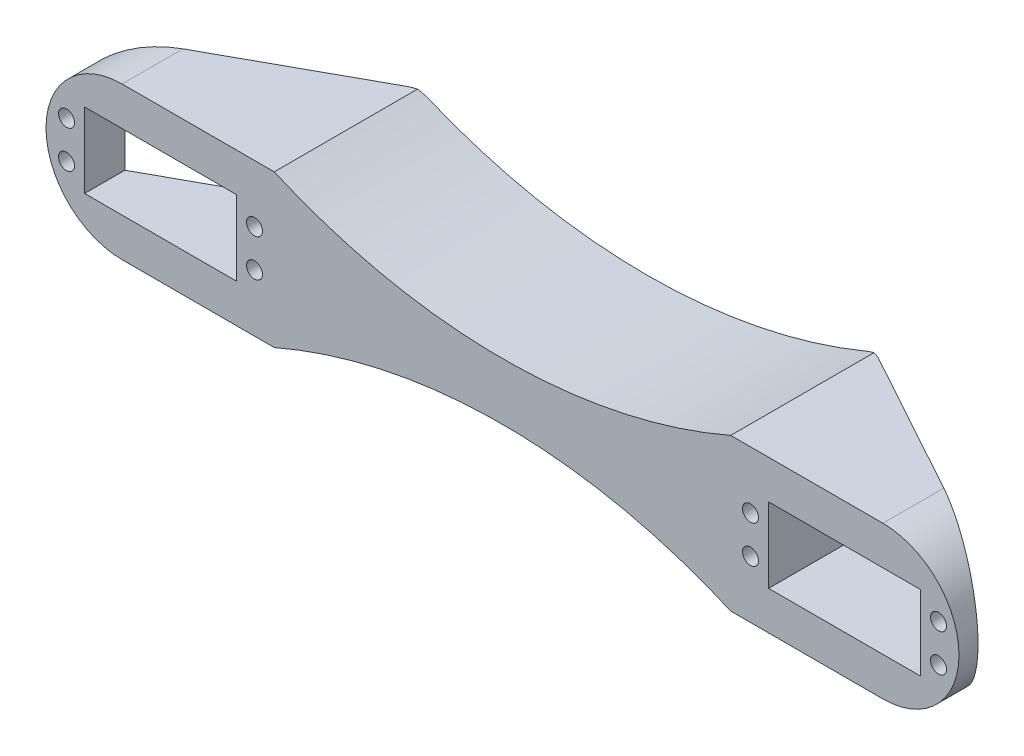
ISO-10303-21;
HEADER;
FILE_DESCRIPTION(('STEP AP214'),'2;1');
FILE_NAME('part.step','',(''),(''),'','','');
FILE_SCHEMA(('AUTOMOTIVE_DESIGN { 1 0 10303 214 1 1 1 1 }'));
ENDSEC;
DATA;
#1=APPLICATION_CONTEXT('core data for automotive mechanical design processes');
#2=APPLICATION_PROTOCOL_DEFINITION('international standard','automotive_design',2000,#1);
#3=PRODUCT_CONTEXT('',#1,'mechanical');
#4=PRODUCT('Part','Part','',(#3));
#5=PRODUCT_RELATED_PRODUCT_CATEGORY('part','',(#4));
#6=PRODUCT_DEFINITION_FORMATION('','',#4);
#7=PRODUCT_DEFINITION_CONTEXT('part definition',#1,'design');
#8=PRODUCT_DEFINITION('design','',#6,#7);
#9=PRODUCT_DEFINITION_SHAPE('','',#8);
#10=(LENGTH_UNIT() NAMED_UNIT(*) SI_UNIT(.MILLI.,.METRE.));
#11=(NAMED_UNIT(*) PLANE_ANGLE_UNIT() SI_UNIT($,.RADIAN.));
#12=(NAMED_UNIT(*) SI_UNIT($,.STERADIAN.) SOLID_ANGLE_UNIT());
#13=UNCERTAINTY_MEASURE_WITH_UNIT(LENGTH_MEASURE(1.E-05),#10,'distance_accuracy_value','');
#14=(GEOMETRIC_REPRESENTATION_CONTEXT(3) GLOBAL_UNCERTAINTY_ASSIGNED_CONTEXT((#13)) GLOBAL_UNIT_ASSIGNED_CONTEXT((#10,
#11,#12)) REPRESENTATION_CONTEXT('',''));
#15=CARTESIAN_POINT('',(0.,0.,0.));
#16=DIRECTION('',(0.,0.,1.));
#17=DIRECTION('',(1.,0.,0.));
#18=AXIS2_PLACEMENT_3D('',#15,#16,#17);
#19=CARTESIAN_POINT('',(-36.5051887767682,38.5934819897084,32.));
#20=DIRECTION('',(0.,1.,0.));
#21=DIRECTION('',(-1.,0.,0.));
#22=AXIS2_PLACEMENT_3D('',#19,#20,#21);
#23=CYLINDRICAL_SURFACE('',#22,10.);
#24=DIRECTION('',(0.,1.,0.));
#25=VECTOR('',#24,1.);
#26=CARTESIAN_POINT('',(-36.5051887767682,38.5934819897084,22.));
#27=LINE('',#26,#25);
#28=CARTESIAN_POINT('',(-36.5051887767682,-0.313840533737619,22.));
#29=VERTEX_POINT('',#28);
#30=CARTESIAN_POINT('',(-36.5051887767682,37.5008045131544,22.));
#31=VERTEX_POINT('',#30);
#32=EDGE_CURVE('E367',#29,#31,#27,.T.);
#33=ORIENTED_EDGE('',*,*,#32,.F.);
#34=CARTESIAN_POINT('',(-39.073756432247,-1.40651801029159,22.3355051762015));
#35=CARTESIAN_POINT('',(-38.7808975319075,-1.27869356042523,22.257657956709));
#36=CARTESIAN_POINT('',(-38.484639299242,-1.15052027733921,22.1931857973709));
#37=CARTESIAN_POINT('',(-37.8894697654478,-0.895328217320755,22.0917104592391));
#38=CARTESIAN_POINT('',(-37.5905913321791,-0.768307618714777,22.0545190184814));
#39=CARTESIAN_POINT('',(-36.9901832720468,-0.515463049608117,22.0072299774098));
#40=CARTESIAN_POINT('',(-36.6886535992128,-0.389639099935494,21.9971328478243));
#41=CARTESIAN_POINT('',(-36.0829416071585,-0.139197163652349,22.0042924866709));
#42=CARTESIAN_POINT('',(-35.778755520429,-0.0145938333329163,22.0217416824713));
#43=CARTESIAN_POINT('',(-35.4753760071928,0.108503406910627,22.0531670537995));
#44=B_SPLINE_CURVE_WITH_KNOTS('',3,(#34,#35,#36,#37,#38,#39,#40,#41,#42,#43),.UNSPECIFIED.,.F.,
.F.,(4,2,2,2,4),(0.,0.986363234291692,1.96585391922786,2.94536162142918,3.93174209814181),.UNSPECIFIED.);
#45=CARTESIAN_POINT('',(-39.073756432247,-1.40651801029159,22.3355051762015));
#46=VERTEX_POINT('',#45);
#47=EDGE_CURVE('E377',#46,#29,#44,.T.);
#48=ORIENTED_EDGE('',*,*,#47,.F.);
#49=CARTESIAN_POINT('',(-36.5051887767682,-1.40651801029159,32.));
#50=DIRECTION('',(0.,1.,0.));
#51=DIRECTION('',(-1.,0.,0.));
#52=AXIS2_PLACEMENT_3D('',#49,#50,#51);
#53=CIRCLE('',#52,10.);
#54=CARTESIAN_POINT('',(-41.3243762744897,-1.40651801029159,23.2378409132335));
#55=VERTEX_POINT('',#54);
#56=EDGE_CURVE('E374',#55,#46,#53,.F.);
#57=ORIENTED_EDGE('',*,*,#56,.F.);
#58=DIRECTION('',(0.,1.,0.));
#59=VECTOR('',#58,1.);
#60=CARTESIAN_POINT('',(-41.3243762744898,38.5934819897084,23.2378409132335));
#61=LINE('',#60,#59);
#62=CARTESIAN_POINT('',(-41.3243762744897,38.5934819897084,23.2378409132335));
#63=VERTEX_POINT('',#62);
#64=EDGE_CURVE('E371',#63,#55,#61,.F.);
#65=ORIENTED_EDGE('',*,*,#64,.F.);
#66=CARTESIAN_POINT('',(-36.5051887767682,38.5934819897084,32.));
#67=DIRECTION('',(0.,-1.,0.));
#68=DIRECTION('',(0.,0.,-1.));
#69=AXIS2_PLACEMENT_3D('',#66,#67,#68);
#70=CIRCLE('',#69,10.);
#71=CARTESIAN_POINT('',(-39.073756432247,38.5934819897084,22.3355051762015));
#72=VERTEX_POINT('',#71);
#73=EDGE_CURVE('E366',#72,#63,#70,.F.);
#74=ORIENTED_EDGE('',*,*,#73,.F.);
#75=CARTESIAN_POINT('',(-36.5051887767682,37.5008045131544,22.));
#76=CARTESIAN_POINT('',(-36.8107474438939,37.6274348146964,21.9999860536576));
#77=CARTESIAN_POINT('',(-37.1158635639228,37.7550878796777,22.0140044105638));
#78=CARTESIAN_POINT('',(-37.7209668442,38.0105809604784,22.0695683106162));
#79=CARTESIAN_POINT('',(-38.0209749588856,38.1384134070893,22.1109203985946));
#80=CARTESIAN_POINT('',(-38.6159563044999,38.3942068405388,22.2206249546986));
#81=CARTESIAN_POINT('',(-38.9109295432117,38.5221678271785,22.2889773810822));
#82=CARTESIAN_POINT('',(-39.495878262977,38.7781073277849,22.4528153843971));
#83=CARTESIAN_POINT('',(-39.7858038287382,38.9060796013979,22.5484889104595));
#84=CARTESIAN_POINT('',(-40.0711220785712,39.0330887302684,22.6574029474084));
#85=B_SPLINE_CURVE_WITH_KNOTS('',3,(#75,#76,#77,#78,#79,#80,#81,#82,#83,#84),.UNSPECIFIED.,.F.,
.F.,(4,2,2,2,4),(0.,0.991952407252828,1.97695835806068,2.96196278607222,3.95391366734705),.UNSPECIFIED.);
#86=EDGE_CURVE('E358',#31,#72,#85,.T.);
#87=ORIENTED_EDGE('',*,*,#86,.F.);
#88=EDGE_LOOP('',(#33,#48,#57,#65,#74,#87));
#89=FACE_BOUND('',#88,.T.);
#90=ADVANCED_FACE('F39',(#89),#23,.T.);
#91=CARTESIAN_POINT('',(78.3576759122742,38.5934819897084,32.));
#92=DIRECTION('',(0.,1.,0.));
#93=DIRECTION('',(-1.,0.,0.));
#94=AXIS2_PLACEMENT_3D('',#91,#92,#93);
#95=CYLINDRICAL_SURFACE('',#94,10.);
#96=DIRECTION('',(0.,1.,0.));
#97=VECTOR('',#96,1.);
#98=CARTESIAN_POINT('',(83.1768634099958,38.5934819897084,23.2378409132335));
#99=LINE('',#98,#97);
#100=CARTESIAN_POINT('',(83.1768634099958,-1.40651801029158,23.2378409132335));
#101=VERTEX_POINT('',#100);
#102=CARTESIAN_POINT('',(83.1768634099958,38.5934819897084,23.2378409132335));
#103=VERTEX_POINT('',#102);
#104=EDGE_CURVE('E324',#101,#103,#99,.T.);
#105=ORIENTED_EDGE('',*,*,#104,.F.);
#106=CARTESIAN_POINT('',(78.3576759122742,-1.40651801029158,32.));
#107=DIRECTION('',(0.,1.,0.));
#108=DIRECTION('',(-1.,0.,0.));
#109=AXIS2_PLACEMENT_3D('',#106,#107,#108);
#110=CIRCLE('',#109,10.);
#111=CARTESIAN_POINT('',(80.926243567753,-1.40651801029158,22.3355051762015));
#112=VERTEX_POINT('',#111);
#113=EDGE_CURVE('E428',#112,#101,#110,.F.);
#114=ORIENTED_EDGE('',*,*,#113,.F.);
#115=CARTESIAN_POINT('',(78.3576759122743,-0.313840533737675,22.));
#116=CARTESIAN_POINT('',(78.6632345794001,-0.44047083527966,21.9999860536576));
#117=CARTESIAN_POINT('',(78.9683506994289,-0.568123900260902,22.0140044105638));
#118=CARTESIAN_POINT('',(79.5734539797061,-0.823616981061645,22.0695683106162));
#119=CARTESIAN_POINT('',(79.8734620943917,-0.951449427672488,22.1109203985946));
#120=CARTESIAN_POINT('',(80.468443440006,-1.20724286112203,22.2206249546986));
#121=CARTESIAN_POINT('',(80.7634166787178,-1.3352038477617,22.2889773810822));
#122=CARTESIAN_POINT('',(81.3483653984832,-1.59114334836818,22.4528153843972));
#123=CARTESIAN_POINT('',(81.6382909642444,-1.71911562198116,22.5484889104595));
#124=CARTESIAN_POINT('',(81.9236092140774,-1.84612475085159,22.6574029474085));
#125=B_SPLINE_CURVE_WITH_KNOTS('',3,(#115,#116,#117,#118,#119,#120,#121,#122,#123,#124),
.UNSPECIFIED.,.F.,.F.,(4,2,2,2,4),(0.,0.99195240725282,1.97695835806067,2.96196278607222,
3.95391366734705),.UNSPECIFIED.);
#126=CARTESIAN_POINT('',(78.3576759122743,-0.313840533737675,22.));
#127=VERTEX_POINT('',#126);
#128=EDGE_CURVE('E434',#127,#112,#125,.T.);
#129=ORIENTED_EDGE('',*,*,#128,.F.);
#130=DIRECTION('',(0.,1.,0.));
#131=VECTOR('',#130,1.);
#132=CARTESIAN_POINT('',(78.3576759122742,38.5934819897084,22.));
#133=LINE('',#132,#131);
#134=CARTESIAN_POINT('',(78.3576759122742,37.5008045131545,22.));
#135=VERTEX_POINT('',#134);
#136=EDGE_CURVE('E340',#135,#127,#133,.F.);
#137=ORIENTED_EDGE('',*,*,#136,.F.);
#138=CARTESIAN_POINT('',(80.926243567753,38.5934819897084,22.3355051762015));
#139=CARTESIAN_POINT('',(80.6333846674135,38.465657539842,22.257657956709));
#140=CARTESIAN_POINT('',(80.3371264347481,38.337484256756,22.1931857973709));
#141=CARTESIAN_POINT('',(79.7419569009539,38.0822921967376,22.0917104592391));
#142=CARTESIAN_POINT('',(79.4430784676851,37.9552715981316,22.0545190184814));
#143=CARTESIAN_POINT('',(78.8426704075528,37.702427029025,22.0072299774098));
#144=CARTESIAN_POINT('',(78.5411407347188,37.5766030793523,21.9971328478243));
#145=CARTESIAN_POINT('',(77.9354287426646,37.3261611430691,22.0042924866709));
#146=CARTESIAN_POINT('',(77.6312426559351,37.2015578127497,22.0217416824713));
#147=CARTESIAN_POINT('',(77.3278631426988,37.0784605725062,22.0531670537995));
#148=B_SPLINE_CURVE_WITH_KNOTS('',3,(#138,#139,#140,#141,#142,#143,#144,#145,#146,#147),
.UNSPECIFIED.,.F.,.F.,(4,2,2,2,4),(0.,0.986363234291689,1.96585391922786,2.94536162142918,
3.93174209814182),.UNSPECIFIED.);
#149=CARTESIAN_POINT('',(80.926243567753,38.5934819897084,22.3355051762015));
#150=VERTEX_POINT('',#149);
#151=EDGE_CURVE('E332',#150,#135,#148,.T.);
#152=ORIENTED_EDGE('',*,*,#151,.F.);
#153=CARTESIAN_POINT('',(78.3576759122742,38.5934819897084,32.));
#154=DIRECTION('',(0.,-1.,0.));
#155=DIRECTION('',(0.,0.,-1.));
#156=AXIS2_PLACEMENT_3D('',#153,#154,#155);
#157=CIRCLE('',#156,10.);
#158=EDGE_CURVE('E329',#103,#150,#157,.F.);
#159=ORIENTED_EDGE('',*,*,#158,.F.);
#160=EDGE_LOOP('',(#105,#114,#129,#137,#152,#159));
#161=FACE_BOUND('',#160,.T.);
#162=ADVANCED_FACE('F342',(#161),#95,.T.);
#163=CARTESIAN_POINT('',(-79.073756432247,-1.40651801029159,60.));
#164=DIRECTION('',(0.,1.,0.));
#165=DIRECTION('',(-1.,0.,0.));
#166=AXIS2_PLACEMENT_3D('',#163,#164,#165);
#167=PLANE('',#166);
#168=DIRECTION('',(0.,0.,-1.));
#169=VECTOR('',#168,1.);
#170=CARTESIAN_POINT('',(80.926243567753,-1.40651801029158,60.));
#171=LINE('',#170,#169);
#172=CARTESIAN_POINT('',(80.926243567753,-1.40651801029158,60.));
#173=VERTEX_POINT('',#172);
#174=EDGE_CURVE('E221',#173,#112,#171,.T.);
#175=ORIENTED_EDGE('',*,*,#174,.T.);
#176=ORIENTED_EDGE('',*,*,#113,.T.);
#177=DIRECTION('',(-0.876215908676647,0.,-0.481918749772156));
#178=VECTOR('',#177,1.);
#179=CARTESIAN_POINT('',(40.926243567753,-1.40651801029159,0.));
#180=LINE('',#179,#178);
#181=CARTESIAN_POINT('',(120.926243567753,-1.40651801029158,44.));
#182=VERTEX_POINT('',#181);
#183=EDGE_CURVE('E235',#182,#101,#180,.T.);
#184=ORIENTED_EDGE('',*,*,#183,.F.);
#185=DIRECTION('',(0.,0.,-1.));
#186=VECTOR('',#185,1.);
#187=CARTESIAN_POINT('',(120.926243567753,-1.40651801029159,60.));
#188=LINE('',#187,#186);
#189=CARTESIAN_POINT('',(120.926243567753,-1.40651801029159,60.));
#190=VERTEX_POINT('',#189);
#191=EDGE_CURVE('E318',#190,#182,#188,.T.);
#192=ORIENTED_EDGE('',*,*,#191,.F.);
#193=DIRECTION('',(1.,0.,0.));
#194=VECTOR('',#193,1.);
#195=CARTESIAN_POINT('',(-79.073756432247,-1.40651801029159,60.));
#196=LINE('',#195,#194);
#197=EDGE_CURVE('E302',#173,#190,#196,.T.);
#198=ORIENTED_EDGE('',*,*,#197,.F.);
#199=EDGE_LOOP('',(#175,#176,#184,#192,#198));
#200=FACE_BOUND('',#199,.T.);
#201=ADVANCED_FACE('F421',(#200),#167,.F.);
#202=CARTESIAN_POINT('',(-79.073756432247,38.5934819897084,60.));
#203=DIRECTION('',(0.,-1.,0.));
#204=DIRECTION('',(0.,0.,-1.));
#205=AXIS2_PLACEMENT_3D('',#202,#203,#204);
#206=PLANE('',#205);
#207=DIRECTION('',(0.,0.,-1.));
#208=VECTOR('',#207,1.);
#209=CARTESIAN_POINT('',(-39.073756432247,38.5934819897084,60.));
#210=LINE('',#209,#208);
#211=CARTESIAN_POINT('',(-39.073756432247,38.5934819897084,60.));
#212=VERTEX_POINT('',#211);
#213=EDGE_CURVE('E210',#212,#72,#210,.T.);
#214=ORIENTED_EDGE('',*,*,#213,.T.);
#215=ORIENTED_EDGE('',*,*,#73,.T.);
#216=DIRECTION('',(-0.876215908676647,0.,0.481918749772156));
#217=VECTOR('',#216,1.);
#218=CARTESIAN_POINT('',(0.926243567753003,38.5934819897084,0.));
#219=LINE('',#218,#217);
#220=CARTESIAN_POINT('',(-79.073756432247,38.5934819897084,44.));
#221=VERTEX_POINT('',#220);
#222=EDGE_CURVE('E218',#63,#221,#219,.T.);
#223=ORIENTED_EDGE('',*,*,#222,.T.);
#224=DIRECTION('',(0.,0.,-1.));
#225=VECTOR('',#224,1.);
#226=CARTESIAN_POINT('',(-79.073756432247,38.5934819897084,60.));
#227=LINE('',#226,#225);
#228=CARTESIAN_POINT('',(-79.073756432247,38.5934819897084,60.));
#229=VERTEX_POINT('',#228);
#230=EDGE_CURVE('E312',#229,#221,#227,.T.);
#231=ORIENTED_EDGE('',*,*,#230,.F.);
#232=DIRECTION('',(-1.,0.,0.));
#233=VECTOR('',#232,1.);
#234=CARTESIAN_POINT('',(-79.073756432247,38.5934819897084,60.));
#235=LINE('',#234,#233);
#236=EDGE_CURVE('E308',#212,#229,#235,.T.);
#237=ORIENTED_EDGE('',*,*,#236,.F.);
#238=EDGE_LOOP('',(#214,#215,#223,#231,#237));
#239=FACE_BOUND('',#238,.T.);
#240=ADVANCED_FACE('F462',(#239),#206,.F.);
#241=CARTESIAN_POINT('',(-79.073756432247,18.5934819897084,60.));
#242=DIRECTION('',(0.,0.,1.));
#243=DIRECTION('',(1.,0.,0.));
#244=AXIS2_PLACEMENT_3D('',#241,#242,#243);
#245=PLANE('',#244);
#246=CARTESIAN_POINT('',(-44.2626108142468,13.6684819897085,60.));
#247=DIRECTION('',(0.,0.,1.));
#248=DIRECTION('',(1.,0.,0.));
#249=AXIS2_PLACEMENT_3D('',#246,#247,#248);
#250=CIRCLE('',#249,2.10000000000001);
#251=CARTESIAN_POINT('',(-42.1626108142468,13.6684819897085,60.));
#252=VERTEX_POINT('',#251);
#253=EDGE_CURVE('E724',#252,#252,#250,.T.);
#254=ORIENTED_EDGE('',*,*,#253,.F.);
#255=EDGE_LOOP('',(#254));
#256=FACE_BOUND('',#255,.T.);
#257=CARTESIAN_POINT('',(-44.2626108142468,23.5184819897085,60.));
#258=DIRECTION('',(0.,0.,1.));
#259=DIRECTION('',(1.,0.,0.));
#260=AXIS2_PLACEMENT_3D('',#257,#258,#259);
#261=CIRCLE('',#260,2.10000000000001);
#262=CARTESIAN_POINT('',(-42.1626108142468,23.5184819897085,60.));
#263=VERTEX_POINT('',#262);
#264=EDGE_CURVE('E726',#263,#263,#261,.T.);
#265=ORIENTED_EDGE('',*,*,#264,.F.);
#266=EDGE_LOOP('',(#265));
#267=FACE_BOUND('',#266,.T.);
#268=CARTESIAN_POINT('',(-93.6849020502472,13.6684819897084,60.));
#269=DIRECTION('',(0.,0.,1.));
#270=DIRECTION('',(1.,0.,0.));
#271=AXIS2_PLACEMENT_3D('',#268,#269,#270);
#272=CIRCLE('',#271,2.10000000000002);
#273=CARTESIAN_POINT('',(-91.5849020502471,13.6684819897084,60.));
#274=VERTEX_POINT('',#273);
#275=EDGE_CURVE('E713',#274,#274,#272,.T.);
#276=ORIENTED_EDGE('',*,*,#275,.F.);
#277=EDGE_LOOP('',(#276));
#278=FACE_BOUND('',#277,.T.);
#279=CARTESIAN_POINT('',(-93.6849020502472,23.5184819897084,60.));
#280=DIRECTION('',(0.,0.,1.));
#281=DIRECTION('',(1.,0.,0.));
#282=AXIS2_PLACEMENT_3D('',#279,#280,#281);
#283=CIRCLE('',#282,2.1);
#284=CARTESIAN_POINT('',(-91.5849020502472,23.5184819897084,60.));
#285=VERTEX_POINT('',#284);
#286=EDGE_CURVE('E720',#285,#285,#283,.T.);
#287=ORIENTED_EDGE('',*,*,#286,.F.);
#288=EDGE_LOOP('',(#287));
#289=FACE_BOUND('',#288,.T.);
#290=DIRECTION('',(0.,-1.,0.));
#291=VECTOR('',#290,1.);
#292=CARTESIAN_POINT('',(-88.923756432247,8.74348198970844,60.));
#293=LINE('',#292,#291);
#294=CARTESIAN_POINT('',(-88.923756432247,28.4434819897085,60.));
#295=VERTEX_POINT('',#294);
#296=CARTESIAN_POINT('',(-88.923756432247,8.74348198970844,60.));
#297=VERTEX_POINT('',#296);
#298=EDGE_CURVE('E56',#295,#297,#293,.T.);
#299=ORIENTED_EDGE('',*,*,#298,.F.);
#300=DIRECTION('',(-1.,0.,0.));
#301=VECTOR('',#300,1.);
#302=CARTESIAN_POINT('',(-88.923756432247,28.4434819897085,60.));
#303=LINE('',#302,#301);
#304=CARTESIAN_POINT('',(-49.023756432247,28.4434819897085,60.));
#305=VERTEX_POINT('',#304);
#306=EDGE_CURVE('E197',#305,#295,#303,.T.);
#307=ORIENTED_EDGE('',*,*,#306,.F.);
#308=DIRECTION('',(0.,1.,0.));
#309=VECTOR('',#308,1.);
#310=CARTESIAN_POINT('',(-49.023756432247,28.4434819897085,60.));
#311=LINE('',#310,#309);
#312=CARTESIAN_POINT('',(-49.023756432247,8.74348198970845,60.));
#313=VERTEX_POINT('',#312);
#314=EDGE_CURVE('E181',#313,#305,#311,.T.);
#315=ORIENTED_EDGE('',*,*,#314,.F.);
#316=DIRECTION('',(1.,0.,0.));
#317=VECTOR('',#316,1.);
#318=CARTESIAN_POINT('',(-49.023756432247,8.74348198970845,60.));
#319=LINE('',#318,#317);
#320=EDGE_CURVE('E190',#297,#313,#319,.T.);
#321=ORIENTED_EDGE('',*,*,#320,.F.);
#322=EDGE_LOOP('',(#299,#307,#315,#321));
#323=FACE_BOUND('',#322,.T.);
#324=CARTESIAN_POINT('',(20.926243567753,176.070752838384,60.));
#325=DIRECTION('',(0.,0.,-1.));
#326=DIRECTION('',(-1.,0.,0.));
#327=AXIS2_PLACEMENT_3D('',#324,#325,#326);
#328=CIRCLE('',#327,150.);
#329=CARTESIAN_POINT('',(80.926243567753,38.5934819897084,60.));
#330=VERTEX_POINT('',#329);
#331=EDGE_CURVE('E207',#330,#212,#328,.T.);
#332=ORIENTED_EDGE('',*,*,#331,.T.);
#333=ORIENTED_EDGE('',*,*,#236,.T.);
#334=CARTESIAN_POINT('',(-79.073756432247,18.5934819897084,60.));
#335=DIRECTION('',(0.,0.,1.));
#336=DIRECTION('',(1.,0.,0.));
#337=AXIS2_PLACEMENT_3D('',#334,#335,#336);
#338=CIRCLE('',#337,20.);
#339=CARTESIAN_POINT('',(-79.073756432247,-1.40651801029159,60.));
#340=VERTEX_POINT('',#339);
#341=EDGE_CURVE('E294',#229,#340,#338,.T.);
#342=ORIENTED_EDGE('',*,*,#341,.T.);
#343=CARTESIAN_POINT('',(-39.073756432247,-1.40651801029159,60.));
#344=VERTEX_POINT('',#343);
#345=EDGE_CURVE('E303',#340,#344,#196,.T.);
#346=ORIENTED_EDGE('',*,*,#345,.T.);
#347=CARTESIAN_POINT('',(20.926243567753,-138.883788858967,60.));
#348=DIRECTION('',(0.,0.,-1.));
#349=DIRECTION('',(1.,0.,0.));
#350=AXIS2_PLACEMENT_3D('',#347,#348,#349);
#351=CIRCLE('',#350,150.);
#352=EDGE_CURVE('E224',#344,#173,#351,.T.);
#353=ORIENTED_EDGE('',*,*,#352,.T.);
#354=ORIENTED_EDGE('',*,*,#197,.T.);
#355=CARTESIAN_POINT('',(120.926243567753,18.5934819897084,60.));
#356=DIRECTION('',(0.,0.,1.));
#357=DIRECTION('',(1.,0.,0.));
#358=AXIS2_PLACEMENT_3D('',#355,#356,#357);
#359=CIRCLE('',#358,20.);
#360=CARTESIAN_POINT('',(120.926243567753,38.5934819897084,60.));
#361=VERTEX_POINT('',#360);
#362=EDGE_CURVE('E306',#190,#361,#359,.T.);
#363=ORIENTED_EDGE('',*,*,#362,.T.);
#364=EDGE_CURVE('E309',#361,#330,#235,.T.);
#365=ORIENTED_EDGE('',*,*,#364,.T.);
#366=EDGE_LOOP('',(#332,#333,#342,#346,#353,#354,#363,#365));
#367=FACE_BOUND('',#366,.T.);
#368=CARTESIAN_POINT('',(135.537389185753,13.6684819897084,60.));
#369=DIRECTION('',(0.,0.,1.));
#370=DIRECTION('',(1.,0.,0.));
#371=AXIS2_PLACEMENT_3D('',#368,#369,#370);
#372=CIRCLE('',#371,2.10000000000002);
#373=CARTESIAN_POINT('',(137.637389185753,13.6684819897084,60.));
#374=VERTEX_POINT('',#373);
#375=EDGE_CURVE('E267',#374,#374,#372,.T.);
#376=ORIENTED_EDGE('',*,*,#375,.F.);
#377=EDGE_LOOP('',(#376));
#378=FACE_BOUND('',#377,.T.);
#379=CARTESIAN_POINT('',(135.537389185753,23.5184819897084,60.));
#380=DIRECTION('',(0.,0.,1.));
#381=DIRECTION('',(1.,0.,0.));
#382=AXIS2_PLACEMENT_3D('',#379,#380,#381);
#383=CIRCLE('',#382,2.10000000000002);
#384=CARTESIAN_POINT('',(137.637389185753,23.5184819897084,60.));
#385=VERTEX_POINT('',#384);
#386=EDGE_CURVE('E275',#385,#385,#383,.T.);
#387=ORIENTED_EDGE('',*,*,#386,.F.);
#388=EDGE_LOOP('',(#387));
#389=FACE_BOUND('',#388,.T.);
#390=CARTESIAN_POINT('',(86.1150979497529,13.6684819897084,60.));
#391=DIRECTION('',(0.,0.,1.));
#392=DIRECTION('',(1.,0.,0.));
#393=AXIS2_PLACEMENT_3D('',#390,#391,#392);
#394=CIRCLE('',#393,2.1);
#395=CARTESIAN_POINT('',(88.2150979497529,13.6684819897084,60.));
#396=VERTEX_POINT('',#395);
#397=EDGE_CURVE('E272',#396,#396,#394,.T.);
#398=ORIENTED_EDGE('',*,*,#397,.F.);
#399=EDGE_LOOP('',(#398));
#400=FACE_BOUND('',#399,.T.);
#401=CARTESIAN_POINT('',(86.1150979497529,23.5184819897084,60.));
#402=DIRECTION('',(0.,0.,1.));
#403=DIRECTION('',(1.,0.,0.));
#404=AXIS2_PLACEMENT_3D('',#401,#402,#403);
#405=CIRCLE('',#404,2.1);
#406=CARTESIAN_POINT('',(88.2150979497529,23.5184819897084,60.));
#407=VERTEX_POINT('',#406);
#408=EDGE_CURVE('E268',#407,#407,#405,.T.);
#409=ORIENTED_EDGE('',*,*,#408,.F.);
#410=EDGE_LOOP('',(#409));
#411=FACE_BOUND('',#410,.T.);
#412=DIRECTION('',(0.,-1.,0.));
#413=VECTOR('',#412,1.);
#414=CARTESIAN_POINT('',(90.8762435677534,8.74348198970842,60.));
#415=LINE('',#414,#413);
#416=CARTESIAN_POINT('',(90.8762435677534,28.4434819897084,60.));
#417=VERTEX_POINT('',#416);
#418=CARTESIAN_POINT('',(90.8762435677534,8.74348198970842,60.));
#419=VERTEX_POINT('',#418);
#420=EDGE_CURVE('E271',#417,#419,#415,.T.);
#421=ORIENTED_EDGE('',*,*,#420,.F.);
#422=DIRECTION('',(-1.,0.,0.));
#423=VECTOR('',#422,1.);
#424=CARTESIAN_POINT('',(90.8762435677534,28.4434819897084,60.));
#425=LINE('',#424,#423);
#426=CARTESIAN_POINT('',(130.776243567753,28.4434819897084,60.));
#427=VERTEX_POINT('',#426);
#428=EDGE_CURVE('E288',#427,#417,#425,.T.);
#429=ORIENTED_EDGE('',*,*,#428,.F.);
#430=DIRECTION('',(0.,1.,0.));
#431=VECTOR('',#430,1.);
#432=CARTESIAN_POINT('',(130.776243567753,28.4434819897084,60.));
#433=LINE('',#432,#431);
#434=CARTESIAN_POINT('',(130.776243567753,8.74348198970842,60.));
#435=VERTEX_POINT('',#434);
#436=EDGE_CURVE('E285',#435,#427,#433,.T.);
#437=ORIENTED_EDGE('',*,*,#436,.F.);
#438=DIRECTION('',(1.,0.,0.));
#439=VECTOR('',#438,1.);
#440=CARTESIAN_POINT('',(130.776243567753,8.74348198970842,60.));
#441=LINE('',#440,#439);
#442=EDGE_CURVE('E282',#419,#435,#441,.T.);
#443=ORIENTED_EDGE('',*,*,#442,.F.);
#444=EDGE_LOOP('',(#421,#429,#437,#443));
#445=FACE_BOUND('',#444,.T.);
#446=ADVANCED_FACE('F194',(#256,#267,#278,#289,#323,#367,#378,#389,#400,#411,#445),#245,.T.);
#447=CARTESIAN_POINT('',(-79.073756432247,18.5934819897084,60.));
#448=DIRECTION('',(0.,0.,-1.));
#449=DIRECTION('',(-1.,0.,0.));
#450=AXIS2_PLACEMENT_3D('',#447,#448,#449);
#451=CYLINDRICAL_SURFACE('',#450,20.);
#452=ORIENTED_EDGE('',*,*,#230,.T.);
#453=CARTESIAN_POINT('',(-79.073756432247,18.5934819897084,44.));
#454=DIRECTION('',(0.481918749772156,0.,0.876215908676647));
#455=DIRECTION('',(0.876215908676647,0.,-0.481918749772156));
#456=AXIS2_PLACEMENT_3D('',#453,#454,#455);
#457=ELLIPSE('',#456,22.8254244210267,20.);
#458=CARTESIAN_POINT('',(-79.073756432247,-1.40651801029159,44.));
#459=VERTEX_POINT('',#458);
#460=EDGE_CURVE('E264',#221,#459,#457,.T.);
#461=ORIENTED_EDGE('',*,*,#460,.T.);
#462=DIRECTION('',(0.,0.,-1.));
#463=VECTOR('',#462,1.);
#464=CARTESIAN_POINT('',(-79.073756432247,-1.40651801029159,60.));
#465=LINE('',#464,#463);
#466=EDGE_CURVE('E321',#340,#459,#465,.T.);
#467=ORIENTED_EDGE('',*,*,#466,.F.);
#468=ORIENTED_EDGE('',*,*,#341,.F.);
#469=EDGE_LOOP('',(#452,#461,#467,#468));
#470=FACE_BOUND('',#469,.T.);
#471=ADVANCED_FACE('F470',(#470),#451,.T.);
#472=DIRECTION('',(-0.876215908676647,0.,0.481918749772156));
#473=VECTOR('',#472,1.);
#474=CARTESIAN_POINT('',(0.926243567753005,-1.40651801029159,0.));
#475=LINE('',#474,#473);
#476=EDGE_CURVE('E238',#55,#459,#475,.T.);
#477=ORIENTED_EDGE('',*,*,#476,.F.);
#478=ORIENTED_EDGE('',*,*,#56,.T.);
#479=DIRECTION('',(0.,0.,-1.));
#480=VECTOR('',#479,1.);
#481=CARTESIAN_POINT('',(-39.073756432247,-1.40651801029159,60.));
#482=LINE('',#481,#480);
#483=EDGE_CURVE('E225',#344,#46,#482,.T.);
#484=ORIENTED_EDGE('',*,*,#483,.F.);
#485=ORIENTED_EDGE('',*,*,#345,.F.);
#486=ORIENTED_EDGE('',*,*,#466,.T.);
#487=EDGE_LOOP('',(#477,#478,#484,#485,#486));
#488=FACE_BOUND('',#487,.T.);
#489=ADVANCED_FACE('F456',(#488),#167,.F.);
#490=CARTESIAN_POINT('',(120.926243567753,18.5934819897084,60.));
#491=DIRECTION('',(0.,0.,-1.));
#492=DIRECTION('',(-1.,0.,0.));
#493=AXIS2_PLACEMENT_3D('',#490,#491,#492);
#494=CYLINDRICAL_SURFACE('',#493,20.);
#495=ORIENTED_EDGE('',*,*,#191,.T.);
#496=CARTESIAN_POINT('',(120.926243567753,18.5934819897084,44.));
#497=DIRECTION('',(-0.481918749772156,0.,0.876215908676647));
#498=DIRECTION('',(-0.876215908676647,0.,-0.481918749772156));
#499=AXIS2_PLACEMENT_3D('',#496,#497,#498);
#500=ELLIPSE('',#499,22.8254244210267,20.);
#501=CARTESIAN_POINT('',(120.926243567753,38.5934819897084,44.));
#502=VERTEX_POINT('',#501);
#503=EDGE_CURVE('E262',#182,#502,#500,.T.);
#504=ORIENTED_EDGE('',*,*,#503,.T.);
#505=DIRECTION('',(0.,0.,-1.));
#506=VECTOR('',#505,1.);
#507=CARTESIAN_POINT('',(120.926243567753,38.5934819897084,60.));
#508=LINE('',#507,#506);
#509=EDGE_CURVE('E315',#361,#502,#508,.T.);
#510=ORIENTED_EDGE('',*,*,#509,.F.);
#511=ORIENTED_EDGE('',*,*,#362,.F.);
#512=EDGE_LOOP('',(#495,#504,#510,#511));
#513=FACE_BOUND('',#512,.T.);
#514=ADVANCED_FACE('F449',(#513),#494,.T.);
#515=DIRECTION('',(-0.876215908676647,0.,-0.481918749772156));
#516=VECTOR('',#515,1.);
#517=CARTESIAN_POINT('',(40.926243567753,38.5934819897084,0.));
#518=LINE('',#517,#516);
#519=EDGE_CURVE('E231',#502,#103,#518,.T.);
#520=ORIENTED_EDGE('',*,*,#519,.T.);
#521=ORIENTED_EDGE('',*,*,#158,.T.);
#522=DIRECTION('',(0.,0.,-1.));
#523=VECTOR('',#522,1.);
#524=CARTESIAN_POINT('',(80.926243567753,38.5934819897084,60.));
#525=LINE('',#524,#523);
#526=EDGE_CURVE('E215',#330,#150,#525,.T.);
#527=ORIENTED_EDGE('',*,*,#526,.F.);
#528=ORIENTED_EDGE('',*,*,#364,.F.);
#529=ORIENTED_EDGE('',*,*,#509,.T.);
#530=EDGE_LOOP('',(#520,#521,#527,#528,#529));
#531=FACE_BOUND('',#530,.T.);
#532=ADVANCED_FACE('F467',(#531),#206,.F.);
#533=CARTESIAN_POINT('',(90.8762435677534,8.74348198970842,0.));
#534=DIRECTION('',(-1.,0.,0.));
#535=DIRECTION('',(0.,0.,1.));
#536=AXIS2_PLACEMENT_3D('',#533,#534,#535);
#537=PLANE('',#536);
#538=DIRECTION('',(0.,0.,1.));
#539=VECTOR('',#538,1.);
#540=CARTESIAN_POINT('',(90.8762435677534,8.74348198970842,0.));
#541=LINE('',#540,#539);
#542=CARTESIAN_POINT('',(90.8762435677534,8.74348198970842,27.4725000000002));
#543=VERTEX_POINT('',#542);
#544=EDGE_CURVE('E291',#543,#419,#541,.T.);
#545=ORIENTED_EDGE('',*,*,#544,.F.);
#546=DIRECTION('',(0.,1.,0.));
#547=VECTOR('',#546,1.);
#548=CARTESIAN_POINT('',(90.8762435677534,8.74348198970842,27.4725000000002));
#549=LINE('',#548,#547);
#550=CARTESIAN_POINT('',(90.8762435677534,28.4434819897084,27.4725000000002));
#551=VERTEX_POINT('',#550);
#552=EDGE_CURVE('E259',#543,#551,#549,.T.);
#553=ORIENTED_EDGE('',*,*,#552,.T.);
#554=DIRECTION('',(0.,0.,1.));
#555=VECTOR('',#554,1.);
#556=CARTESIAN_POINT('',(90.8762435677534,28.4434819897084,0.));
#557=LINE('',#556,#555);
#558=EDGE_CURVE('E292',#551,#417,#557,.T.);
#559=ORIENTED_EDGE('',*,*,#558,.T.);
#560=ORIENTED_EDGE('',*,*,#420,.T.);
#561=EDGE_LOOP('',(#545,#553,#559,#560));
#562=FACE_BOUND('',#561,.T.);
#563=ADVANCED_FACE('F483',(#562),#537,.F.);
#564=CARTESIAN_POINT('',(90.8762435677534,28.4434819897084,0.));
#565=DIRECTION('',(0.,1.,0.));
#566=DIRECTION('',(-1.,0.,0.));
#567=AXIS2_PLACEMENT_3D('',#564,#565,#566);
#568=PLANE('',#567);
#569=ORIENTED_EDGE('',*,*,#558,.F.);
#570=DIRECTION('',(0.876215908676647,0.,0.481918749772156));
#571=VECTOR('',#570,1.);
#572=CARTESIAN_POINT('',(79.2755717827245,28.4434819897084,21.0921305182343));
#573=LINE('',#572,#571);
#574=CARTESIAN_POINT('',(130.776243567753,28.4434819897084,49.4175000000002));
#575=VERTEX_POINT('',#574);
#576=EDGE_CURVE('E256',#551,#575,#573,.T.);
#577=ORIENTED_EDGE('',*,*,#576,.T.);
#578=DIRECTION('',(0.,0.,1.));
#579=VECTOR('',#578,1.);
#580=CARTESIAN_POINT('',(130.776243567753,28.4434819897084,0.));
#581=LINE('',#580,#579);
#582=EDGE_CURVE('E295',#575,#427,#581,.T.);
#583=ORIENTED_EDGE('',*,*,#582,.T.);
#584=ORIENTED_EDGE('',*,*,#428,.T.);
#585=EDGE_LOOP('',(#569,#577,#583,#584));
#586=FACE_BOUND('',#585,.T.);
#587=ADVANCED_FACE('F487',(#586),#568,.F.);
#588=CARTESIAN_POINT('',(130.776243567753,28.4434819897084,0.));
#589=DIRECTION('',(1.,0.,0.));
#590=DIRECTION('',(0.,0.,-1.));
#591=AXIS2_PLACEMENT_3D('',#588,#589,#590);
#592=PLANE('',#591);
#593=ORIENTED_EDGE('',*,*,#582,.F.);
#594=DIRECTION('',(0.,-1.,0.));
#595=VECTOR('',#594,1.);
#596=CARTESIAN_POINT('',(130.776243567753,28.4434819897084,49.4175000000002));
#597=LINE('',#596,#595);
#598=CARTESIAN_POINT('',(130.776243567753,8.74348198970842,49.4175000000002));
#599=VERTEX_POINT('',#598);
#600=EDGE_CURVE('E253',#575,#599,#597,.T.);
#601=ORIENTED_EDGE('',*,*,#600,.T.);
#602=DIRECTION('',(0.,0.,1.));
#603=VECTOR('',#602,1.);
#604=CARTESIAN_POINT('',(130.776243567753,8.74348198970842,0.));
#605=LINE('',#604,#603);
#606=EDGE_CURVE('E297',#599,#435,#605,.T.);
#607=ORIENTED_EDGE('',*,*,#606,.T.);
#608=ORIENTED_EDGE('',*,*,#436,.T.);
#609=EDGE_LOOP('',(#593,#601,#607,#608));
#610=FACE_BOUND('',#609,.T.);
#611=ADVANCED_FACE('F493',(#610),#592,.F.);
#612=CARTESIAN_POINT('',(130.776243567753,8.74348198970842,0.));
#613=DIRECTION('',(0.,-1.,0.));
#614=DIRECTION('',(1.,0.,0.));
#615=AXIS2_PLACEMENT_3D('',#612,#613,#614);
#616=PLANE('',#615);
#617=ORIENTED_EDGE('',*,*,#606,.F.);
#618=DIRECTION('',(-0.876215908676647,0.,-0.481918749772156));
#619=VECTOR('',#618,1.);
#620=CARTESIAN_POINT('',(109.908969095584,8.74348198970842,37.9404990403073));
#621=LINE('',#620,#619);
#622=EDGE_CURVE('E250',#599,#543,#621,.T.);
#623=ORIENTED_EDGE('',*,*,#622,.T.);
#624=ORIENTED_EDGE('',*,*,#544,.T.);
#625=ORIENTED_EDGE('',*,*,#442,.T.);
#626=EDGE_LOOP('',(#617,#623,#624,#625));
#627=FACE_BOUND('',#626,.T.);
#628=ADVANCED_FACE('F489',(#627),#616,.F.);
#629=CARTESIAN_POINT('',(86.1150979497529,23.5184819897084,0.));
#630=DIRECTION('',(0.,0.,1.));
#631=DIRECTION('',(1.,0.,0.));
#632=AXIS2_PLACEMENT_3D('',#629,#630,#631);
#633=CYLINDRICAL_SURFACE('',#632,2.1);
#634=CARTESIAN_POINT('',(86.1150979497529,23.5184819897084,24.8538699100999));
#635=DIRECTION('',(-0.481918749772156,0.,0.876215908676647));
#636=DIRECTION('',(0.876215908676647,0.,0.481918749772156));
#637=AXIS2_PLACEMENT_3D('',#634,#635,#636);
#638=ELLIPSE('',#637,2.3966695642078,2.1);
#639=CARTESIAN_POINT('',(88.2150979497529,23.5184819897084,26.0088699100999));
#640=VERTEX_POINT('',#639);
#641=EDGE_CURVE('E247',#640,#640,#638,.F.);
#642=ORIENTED_EDGE('',*,*,#641,.T.);
#643=EDGE_LOOP('',(#642));
#644=FACE_BOUND('',#643,.T.);
#645=ORIENTED_EDGE('',*,*,#408,.T.);
#646=EDGE_LOOP('',(#645));
#647=FACE_BOUND('',#646,.T.);
#648=ADVANCED_FACE('F492',(#644,#647),#633,.F.);
#649=CARTESIAN_POINT('',(86.1150979497529,13.6684819897084,0.));
#650=DIRECTION('',(0.,0.,1.));
#651=DIRECTION('',(1.,0.,0.));
#652=AXIS2_PLACEMENT_3D('',#649,#650,#651);
#653=CYLINDRICAL_SURFACE('',#652,2.1);
#654=CARTESIAN_POINT('',(86.1150979497529,13.6684819897084,24.8538699100999));
#655=DIRECTION('',(-0.481918749772156,0.,0.876215908676647));
#656=DIRECTION('',(0.876215908676647,0.,0.481918749772156));
#657=AXIS2_PLACEMENT_3D('',#654,#655,#656);
#658=ELLIPSE('',#657,2.3966695642078,2.1);
#659=CARTESIAN_POINT('',(88.2150979497529,13.6684819897084,26.0088699100999));
#660=VERTEX_POINT('',#659);
#661=EDGE_CURVE('E244',#660,#660,#658,.F.);
#662=ORIENTED_EDGE('',*,*,#661,.T.);
#663=EDGE_LOOP('',(#662));
#664=FACE_BOUND('',#663,.T.);
#665=ORIENTED_EDGE('',*,*,#397,.T.);
#666=EDGE_LOOP('',(#665));
#667=FACE_BOUND('',#666,.T.);
#668=ADVANCED_FACE('F508',(#664,#667),#653,.F.);
#669=CARTESIAN_POINT('',(135.537389185753,23.5184819897084,0.));
#670=DIRECTION('',(0.,0.,1.));
#671=DIRECTION('',(1.,0.,0.));
#672=AXIS2_PLACEMENT_3D('',#669,#670,#671);
#673=CYLINDRICAL_SURFACE('',#672,2.10000000000002);
#674=CARTESIAN_POINT('',(135.537389185753,23.5184819897084,52.0361300899001));
#675=DIRECTION('',(-0.481918749772156,0.,0.876215908676647));
#676=DIRECTION('',(0.876215908676647,0.,0.481918749772156));
#677=AXIS2_PLACEMENT_3D('',#674,#675,#676);
#678=ELLIPSE('',#677,2.39666956420782,2.10000000000002);
#679=CARTESIAN_POINT('',(137.637389185753,23.5184819897084,53.1911300899001));
#680=VERTEX_POINT('',#679);
#681=EDGE_CURVE('E241',#680,#680,#678,.F.);
#682=ORIENTED_EDGE('',*,*,#681,.T.);
#683=EDGE_LOOP('',(#682));
#684=FACE_BOUND('',#683,.T.);
#685=ORIENTED_EDGE('',*,*,#386,.T.);
#686=EDGE_LOOP('',(#685));
#687=FACE_BOUND('',#686,.T.);
#688=ADVANCED_FACE('F504',(#684,#687),#673,.F.);
#689=CARTESIAN_POINT('',(135.537389185753,13.6684819897084,0.));
#690=DIRECTION('',(0.,0.,1.));
#691=DIRECTION('',(1.,0.,0.));
#692=AXIS2_PLACEMENT_3D('',#689,#690,#691);
#693=CYLINDRICAL_SURFACE('',#692,2.10000000000002);
#694=CARTESIAN_POINT('',(135.537389185753,13.6684819897084,52.0361300899001));
#695=DIRECTION('',(-0.481918749772156,0.,0.876215908676647));
#696=DIRECTION('',(0.876215908676647,0.,0.481918749772156));
#697=AXIS2_PLACEMENT_3D('',#694,#695,#696);
#698=ELLIPSE('',#697,2.39666956420782,2.10000000000002);
#699=CARTESIAN_POINT('',(137.637389185753,13.6684819897084,53.1911300899001));
#700=VERTEX_POINT('',#699);
#701=EDGE_CURVE('E234',#700,#700,#698,.F.);
#702=ORIENTED_EDGE('',*,*,#701,.T.);
#703=EDGE_LOOP('',(#702));
#704=FACE_BOUND('',#703,.T.);
#705=ORIENTED_EDGE('',*,*,#375,.T.);
#706=EDGE_LOOP('',(#705));
#707=FACE_BOUND('',#706,.T.);
#708=ADVANCED_FACE('F501',(#704,#707),#693,.F.);
#709=CARTESIAN_POINT('',(40.926243567753,38.5934819897084,0.));
#710=DIRECTION('',(-0.481918749772156,0.,0.876215908676647));
#711=DIRECTION('',(0.876215908676647,0.,0.481918749772156));
#712=AXIS2_PLACEMENT_3D('',#709,#710,#711);
#713=PLANE('',#712);
#714=ORIENTED_EDGE('',*,*,#661,.F.);
#715=EDGE_LOOP('',(#714));
#716=FACE_BOUND('',#715,.T.);
#717=ORIENTED_EDGE('',*,*,#701,.F.);
#718=EDGE_LOOP('',(#717));
#719=FACE_BOUND('',#718,.T.);
#720=ORIENTED_EDGE('',*,*,#681,.F.);
#721=EDGE_LOOP('',(#720));
#722=FACE_BOUND('',#721,.T.);
#723=ORIENTED_EDGE('',*,*,#641,.F.);
#724=EDGE_LOOP('',(#723));
#725=FACE_BOUND('',#724,.T.);
#726=ORIENTED_EDGE('',*,*,#622,.F.);
#727=ORIENTED_EDGE('',*,*,#600,.F.);
#728=ORIENTED_EDGE('',*,*,#576,.F.);
#729=ORIENTED_EDGE('',*,*,#552,.F.);
#730=EDGE_LOOP('',(#726,#727,#728,#729));
#731=FACE_BOUND('',#730,.T.);
#732=ORIENTED_EDGE('',*,*,#183,.T.);
#733=ORIENTED_EDGE('',*,*,#104,.T.);
#734=ORIENTED_EDGE('',*,*,#519,.F.);
#735=ORIENTED_EDGE('',*,*,#503,.F.);
#736=EDGE_LOOP('',(#732,#733,#734,#735));
#737=FACE_BOUND('',#736,.T.);
#738=ADVANCED_FACE('F446',(#716,#719,#722,#725,#731,#737),#713,.F.);
#739=CARTESIAN_POINT('',(0.926243567753003,38.5934819897084,0.));
#740=DIRECTION('',(0.481918749772156,0.,0.876215908676647));
#741=DIRECTION('',(0.876215908676647,0.,-0.481918749772156));
#742=AXIS2_PLACEMENT_3D('',#739,#740,#741);
#743=PLANE('',#742);
#744=CARTESIAN_POINT('',(-44.2626108142468,13.6684819897085,24.8538699100999));
#745=DIRECTION('',(0.481918749772156,0.,0.876215908676647));
#746=DIRECTION('',(-0.876215908676647,0.,0.481918749772156));
#747=AXIS2_PLACEMENT_3D('',#744,#745,#746);
#748=ELLIPSE('',#747,2.39666956420781,2.10000000000001);
#749=CARTESIAN_POINT('',(-46.3626108142469,13.6684819897085,26.0088699100999));
#750=VERTEX_POINT('',#749);
#751=EDGE_CURVE('E43',#750,#750,#748,.T.);
#752=ORIENTED_EDGE('',*,*,#751,.T.);
#753=EDGE_LOOP('',(#752));
#754=FACE_BOUND('',#753,.T.);
#755=CARTESIAN_POINT('',(-44.2626108142468,23.5184819897085,24.8538699100999));
#756=DIRECTION('',(0.481918749772156,0.,0.876215908676647));
#757=DIRECTION('',(-0.876215908676647,0.,0.481918749772156));
#758=AXIS2_PLACEMENT_3D('',#755,#756,#757);
#759=ELLIPSE('',#758,2.39666956420781,2.10000000000001);
#760=CARTESIAN_POINT('',(-46.3626108142469,23.5184819897085,26.0088699100999));
#761=VERTEX_POINT('',#760);
#762=EDGE_CURVE('E392',#761,#761,#759,.T.);
#763=ORIENTED_EDGE('',*,*,#762,.T.);
#764=EDGE_LOOP('',(#763));
#765=FACE_BOUND('',#764,.T.);
#766=CARTESIAN_POINT('',(-93.6849020502472,13.6684819897084,52.0361300899001));
#767=DIRECTION('',(0.481918749772156,0.,0.876215908676647));
#768=DIRECTION('',(-0.876215908676647,0.,0.481918749772156));
#769=AXIS2_PLACEMENT_3D('',#766,#767,#768);
#770=ELLIPSE('',#769,2.39666956420782,2.10000000000002);
#771=CARTESIAN_POINT('',(-95.7849020502472,13.6684819897084,53.1911300899001));
#772=VERTEX_POINT('',#771);
#773=EDGE_CURVE('E390',#772,#772,#770,.T.);
#774=ORIENTED_EDGE('',*,*,#773,.T.);
#775=EDGE_LOOP('',(#774));
#776=FACE_BOUND('',#775,.T.);
#777=CARTESIAN_POINT('',(-93.6849020502472,23.5184819897084,52.0361300899001));
#778=DIRECTION('',(0.481918749772156,0.,0.876215908676647));
#779=DIRECTION('',(-0.876215908676647,0.,0.481918749772156));
#780=AXIS2_PLACEMENT_3D('',#777,#778,#779);
#781=ELLIPSE('',#780,2.3966695642078,2.1);
#782=CARTESIAN_POINT('',(-95.7849020502472,23.5184819897084,53.1911300899001));
#783=VERTEX_POINT('',#782);
#784=EDGE_CURVE('E204',#783,#783,#781,.T.);
#785=ORIENTED_EDGE('',*,*,#784,.T.);
#786=EDGE_LOOP('',(#785));
#787=FACE_BOUND('',#786,.T.);
#788=DIRECTION('',(-0.876215908676647,0.,0.481918749772156));
#789=VECTOR('',#788,1.);
#790=CARTESIAN_POINT('',(0.926243567753004,28.4434819897085,0.));
#791=LINE('',#790,#789);
#792=CARTESIAN_POINT('',(-49.023756432247,28.4434819897085,27.4725));
#793=VERTEX_POINT('',#792);
#794=CARTESIAN_POINT('',(-88.923756432247,28.4434819897085,49.4175));
#795=VERTEX_POINT('',#794);
#796=EDGE_CURVE('E48',#793,#795,#791,.T.);
#797=ORIENTED_EDGE('',*,*,#796,.T.);
#798=DIRECTION('',(0.,-1.,0.));
#799=VECTOR('',#798,1.);
#800=CARTESIAN_POINT('',(-88.923756432247,38.5934819897084,49.4175));
#801=LINE('',#800,#799);
#802=CARTESIAN_POINT('',(-88.923756432247,8.74348198970844,49.4175));
#803=VERTEX_POINT('',#802);
#804=EDGE_CURVE('E11',#795,#803,#801,.T.);
#805=ORIENTED_EDGE('',*,*,#804,.T.);
#806=DIRECTION('',(0.876215908676647,0.,-0.481918749772156));
#807=VECTOR('',#806,1.);
#808=CARTESIAN_POINT('',(0.926243567753006,8.74348198970846,0.));
#809=LINE('',#808,#807);
#810=CARTESIAN_POINT('',(-49.023756432247,8.74348198970845,27.4725));
#811=VERTEX_POINT('',#810);
#812=EDGE_CURVE('E383',#803,#811,#809,.T.);
#813=ORIENTED_EDGE('',*,*,#812,.T.);
#814=DIRECTION('',(0.,1.,0.));
#815=VECTOR('',#814,1.);
#816=CARTESIAN_POINT('',(-49.0237564322471,38.5934819897084,27.4725));
#817=LINE('',#816,#815);
#818=EDGE_CURVE('E184',#811,#793,#817,.T.);
#819=ORIENTED_EDGE('',*,*,#818,.T.);
#820=EDGE_LOOP('',(#797,#805,#813,#819));
#821=FACE_BOUND('',#820,.T.);
#822=ORIENTED_EDGE('',*,*,#222,.F.);
#823=ORIENTED_EDGE('',*,*,#64,.T.);
#824=ORIENTED_EDGE('',*,*,#476,.T.);
#825=ORIENTED_EDGE('',*,*,#460,.F.);
#826=EDGE_LOOP('',(#822,#823,#824,#825));
#827=FACE_BOUND('',#826,.T.);
#828=ADVANCED_FACE('F399',(#754,#765,#776,#787,#821,#827),#743,.F.);
#829=CARTESIAN_POINT('',(-42.1626108142468,38.5934819897084,22.));
#830=DIRECTION('',(0.,0.,1.));
#831=DIRECTION('',(1.,0.,0.));
#832=AXIS2_PLACEMENT_3D('',#829,#830,#831);
#833=PLANE('',#832);
#834=CARTESIAN_POINT('',(20.926243567753,-138.883788858967,22.));
#835=DIRECTION('',(0.,0.,-1.));
#836=DIRECTION('',(1.,0.,0.));
#837=AXIS2_PLACEMENT_3D('',#834,#835,#836);
#838=CIRCLE('',#837,150.);
#839=EDGE_CURVE('E214',#29,#127,#838,.T.);
#840=ORIENTED_EDGE('',*,*,#839,.F.);
#841=ORIENTED_EDGE('',*,*,#32,.T.);
#842=CARTESIAN_POINT('',(20.926243567753,176.070752838384,22.));
#843=DIRECTION('',(0.,0.,-1.));
#844=DIRECTION('',(-1.,0.,0.));
#845=AXIS2_PLACEMENT_3D('',#842,#843,#844);
#846=CIRCLE('',#845,150.);
#847=EDGE_CURVE('E211',#135,#31,#846,.T.);
#848=ORIENTED_EDGE('',*,*,#847,.F.);
#849=ORIENTED_EDGE('',*,*,#136,.T.);
#850=EDGE_LOOP('',(#840,#841,#848,#849));
#851=FACE_BOUND('',#850,.T.);
#852=ADVANCED_FACE('F430',(#851),#833,.F.);
#853=CARTESIAN_POINT('',(20.926243567753,-138.883788858967,60.));
#854=DIRECTION('',(0.,0.,-1.));
#855=DIRECTION('',(-1.,0.,0.));
#856=AXIS2_PLACEMENT_3D('',#853,#854,#855);
#857=CYLINDRICAL_SURFACE('',#856,150.);
#858=ORIENTED_EDGE('',*,*,#483,.T.);
#859=ORIENTED_EDGE('',*,*,#47,.T.);
#860=ORIENTED_EDGE('',*,*,#839,.T.);
#861=ORIENTED_EDGE('',*,*,#128,.T.);
#862=ORIENTED_EDGE('',*,*,#174,.F.);
#863=ORIENTED_EDGE('',*,*,#352,.F.);
#864=EDGE_LOOP('',(#858,#859,#860,#861,#862,#863));
#865=FACE_BOUND('',#864,.T.);
#866=ADVANCED_FACE('F351',(#865),#857,.F.);
#867=CARTESIAN_POINT('',(20.926243567753,176.070752838384,60.));
#868=DIRECTION('',(0.,0.,-1.));
#869=DIRECTION('',(-1.,0.,0.));
#870=AXIS2_PLACEMENT_3D('',#867,#868,#869);
#871=CYLINDRICAL_SURFACE('',#870,150.);
#872=ORIENTED_EDGE('',*,*,#847,.T.);
#873=ORIENTED_EDGE('',*,*,#86,.T.);
#874=ORIENTED_EDGE('',*,*,#213,.F.);
#875=ORIENTED_EDGE('',*,*,#331,.F.);
#876=ORIENTED_EDGE('',*,*,#526,.T.);
#877=ORIENTED_EDGE('',*,*,#151,.T.);
#878=EDGE_LOOP('',(#872,#873,#874,#875,#876,#877));
#879=FACE_BOUND('',#878,.T.);
#880=ADVANCED_FACE('F345',(#879),#871,.F.);
#881=CARTESIAN_POINT('',(-88.923756432247,8.74348198970844,20.));
#882=DIRECTION('',(-1.,0.,0.));
#883=DIRECTION('',(0.,0.,1.));
#884=AXIS2_PLACEMENT_3D('',#881,#882,#883);
#885=PLANE('',#884);
#886=DIRECTION('',(0.,0.,1.));
#887=VECTOR('',#886,1.);
#888=CARTESIAN_POINT('',(-88.923756432247,28.4434819897085,20.));
#889=LINE('',#888,#887);
#890=EDGE_CURVE('E202',#795,#295,#889,.T.);
#891=ORIENTED_EDGE('',*,*,#890,.T.);
#892=ORIENTED_EDGE('',*,*,#298,.T.);
#893=DIRECTION('',(0.,0.,1.));
#894=VECTOR('',#893,1.);
#895=CARTESIAN_POINT('',(-88.923756432247,8.74348198970844,20.));
#896=LINE('',#895,#894);
#897=EDGE_CURVE('E187',#803,#297,#896,.T.);
#898=ORIENTED_EDGE('',*,*,#897,.F.);
#899=ORIENTED_EDGE('',*,*,#804,.F.);
#900=EDGE_LOOP('',(#891,#892,#898,#899));
#901=FACE_BOUND('',#900,.T.);
#902=ADVANCED_FACE('F350',(#901),#885,.F.);
#903=CARTESIAN_POINT('',(-88.923756432247,28.4434819897085,20.));
#904=DIRECTION('',(0.,1.,0.));
#905=DIRECTION('',(-1.,0.,0.));
#906=AXIS2_PLACEMENT_3D('',#903,#904,#905);
#907=PLANE('',#906);
#908=DIRECTION('',(0.,0.,1.));
#909=VECTOR('',#908,1.);
#910=CARTESIAN_POINT('',(-49.023756432247,28.4434819897085,20.));
#911=LINE('',#910,#909);
#912=EDGE_CURVE('E186',#793,#305,#911,.T.);
#913=ORIENTED_EDGE('',*,*,#912,.T.);
#914=ORIENTED_EDGE('',*,*,#306,.T.);
#915=ORIENTED_EDGE('',*,*,#890,.F.);
#916=ORIENTED_EDGE('',*,*,#796,.F.);
#917=EDGE_LOOP('',(#913,#914,#915,#916));
#918=FACE_BOUND('',#917,.T.);
#919=ADVANCED_FACE('F550',(#918),#907,.F.);
#920=CARTESIAN_POINT('',(-49.023756432247,28.4434819897085,20.));
#921=DIRECTION('',(1.,0.,0.));
#922=DIRECTION('',(0.,1.,0.));
#923=AXIS2_PLACEMENT_3D('',#920,#921,#922);
#924=PLANE('',#923);
#925=DIRECTION('',(0.,0.,1.));
#926=VECTOR('',#925,1.);
#927=CARTESIAN_POINT('',(-49.023756432247,8.74348198970845,20.));
#928=LINE('',#927,#926);
#929=EDGE_CURVE('E64',#811,#313,#928,.T.);
#930=ORIENTED_EDGE('',*,*,#929,.T.);
#931=ORIENTED_EDGE('',*,*,#314,.T.);
#932=ORIENTED_EDGE('',*,*,#912,.F.);
#933=ORIENTED_EDGE('',*,*,#818,.F.);
#934=EDGE_LOOP('',(#930,#931,#932,#933));
#935=FACE_BOUND('',#934,.T.);
#936=ADVANCED_FACE('F178',(#935),#924,.F.);
#937=CARTESIAN_POINT('',(-49.023756432247,8.74348198970845,20.));
#938=DIRECTION('',(0.,-1.,0.));
#939=DIRECTION('',(1.,0.,0.));
#940=AXIS2_PLACEMENT_3D('',#937,#938,#939);
#941=PLANE('',#940);
#942=ORIENTED_EDGE('',*,*,#897,.T.);
#943=ORIENTED_EDGE('',*,*,#320,.T.);
#944=ORIENTED_EDGE('',*,*,#929,.F.);
#945=ORIENTED_EDGE('',*,*,#812,.F.);
#946=EDGE_LOOP('',(#942,#943,#944,#945));
#947=FACE_BOUND('',#946,.T.);
#948=ADVANCED_FACE('F191',(#947),#941,.F.);
#949=CARTESIAN_POINT('',(-93.6849020502472,23.5184819897084,20.));
#950=DIRECTION('',(0.,0.,1.));
#951=DIRECTION('',(1.,0.,0.));
#952=AXIS2_PLACEMENT_3D('',#949,#950,#951);
#953=CYLINDRICAL_SURFACE('',#952,2.1);
#954=ORIENTED_EDGE('',*,*,#286,.T.);
#955=EDGE_LOOP('',(#954));
#956=FACE_BOUND('',#955,.T.);
#957=ORIENTED_EDGE('',*,*,#784,.F.);
#958=EDGE_LOOP('',(#957));
#959=FACE_BOUND('',#958,.T.);
#960=ADVANCED_FACE('F571',(#956,#959),#953,.F.);
#961=CARTESIAN_POINT('',(-93.6849020502472,13.6684819897084,20.));
#962=DIRECTION('',(0.,0.,1.));
#963=DIRECTION('',(1.,0.,0.));
#964=AXIS2_PLACEMENT_3D('',#961,#962,#963);
#965=CYLINDRICAL_SURFACE('',#964,2.10000000000002);
#966=ORIENTED_EDGE('',*,*,#275,.T.);
#967=EDGE_LOOP('',(#966));
#968=FACE_BOUND('',#967,.T.);
#969=ORIENTED_EDGE('',*,*,#773,.F.);
#970=EDGE_LOOP('',(#969));
#971=FACE_BOUND('',#970,.T.);
#972=ADVANCED_FACE('F409',(#968,#971),#965,.F.);
#973=CARTESIAN_POINT('',(-44.2626108142468,23.5184819897085,20.));
#974=DIRECTION('',(0.,0.,1.));
#975=DIRECTION('',(1.,0.,0.));
#976=AXIS2_PLACEMENT_3D('',#973,#974,#975);
#977=CYLINDRICAL_SURFACE('',#976,2.10000000000001);
#978=ORIENTED_EDGE('',*,*,#264,.T.);
#979=EDGE_LOOP('',(#978));
#980=FACE_BOUND('',#979,.T.);
#981=ORIENTED_EDGE('',*,*,#762,.F.);
#982=EDGE_LOOP('',(#981));
#983=FACE_BOUND('',#982,.T.);
#984=ADVANCED_FACE('F403',(#980,#983),#977,.F.);
#985=CARTESIAN_POINT('',(-44.2626108142468,13.6684819897085,20.));
#986=DIRECTION('',(0.,0.,1.));
#987=DIRECTION('',(1.,0.,0.));
#988=AXIS2_PLACEMENT_3D('',#985,#986,#987);
#989=CYLINDRICAL_SURFACE('',#988,2.10000000000001);
#990=ORIENTED_EDGE('',*,*,#253,.T.);
#991=EDGE_LOOP('',(#990));
#992=FACE_BOUND('',#991,.T.);
#993=ORIENTED_EDGE('',*,*,#751,.F.);
#994=EDGE_LOOP('',(#993));
#995=FACE_BOUND('',#994,.T.);
#996=ADVANCED_FACE('F401',(#992,#995),#989,.F.);
#997=CLOSED_SHELL('',(#90,#162,#201,#240,#446,#471,#489,#514,#532,#563,#587,#611,#628,#648,#668,
#688,#708,#738,#828,#852,#866,#880,#902,#919,#936,#948,#960,#972,#984,#996));
#998=MANIFOLD_SOLID_BREP('B2',#997);
#999=ADVANCED_BREP_SHAPE_REPRESENTATION('',(#18,#998),#14);
#1000=SHAPE_DEFINITION_REPRESENTATION(#9,#999);
ENDSEC;
END-ISO-10303-21;
